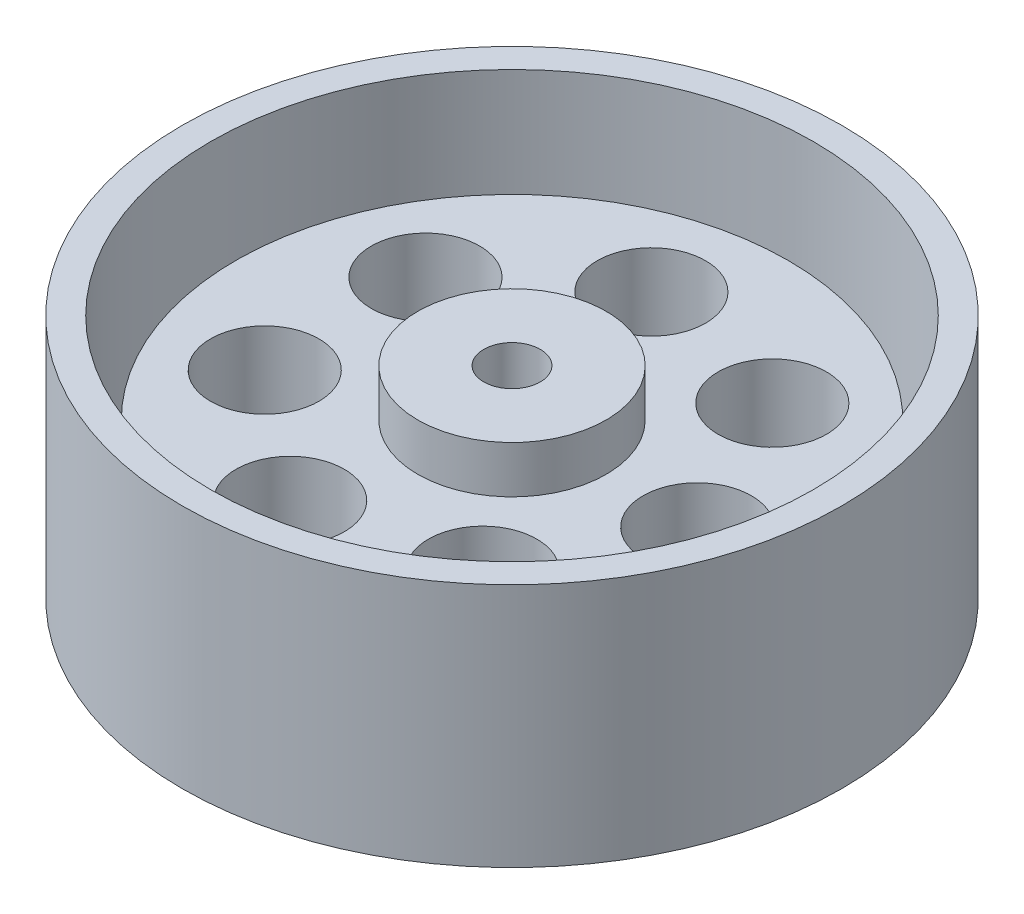
ISO-10303-21;
HEADER;
FILE_DESCRIPTION(('STEP AP214'),'2;1');
FILE_NAME('part.step','',(''),(''),'','','');
FILE_SCHEMA(('AUTOMOTIVE_DESIGN { 1 0 10303 214 1 1 1 1 }'));
ENDSEC;
DATA;
#1=APPLICATION_CONTEXT('core data for automotive mechanical design processes');
#2=APPLICATION_PROTOCOL_DEFINITION('international standard','automotive_design',2000,#1);
#3=PRODUCT_CONTEXT('',#1,'mechanical');
#4=PRODUCT('Part','Part','',(#3));
#5=PRODUCT_RELATED_PRODUCT_CATEGORY('part','',(#4));
#6=PRODUCT_DEFINITION_FORMATION('','',#4);
#7=PRODUCT_DEFINITION_CONTEXT('part definition',#1,'design');
#8=PRODUCT_DEFINITION('design','',#6,#7);
#9=PRODUCT_DEFINITION_SHAPE('','',#8);
#10=(LENGTH_UNIT() NAMED_UNIT(*) SI_UNIT(.MILLI.,.METRE.));
#11=(NAMED_UNIT(*) PLANE_ANGLE_UNIT() SI_UNIT($,.RADIAN.));
#12=(NAMED_UNIT(*) SI_UNIT($,.STERADIAN.) SOLID_ANGLE_UNIT());
#13=UNCERTAINTY_MEASURE_WITH_UNIT(LENGTH_MEASURE(1.E-05),#10,'distance_accuracy_value','');
#14=(GEOMETRIC_REPRESENTATION_CONTEXT(3) GLOBAL_UNCERTAINTY_ASSIGNED_CONTEXT((#13)) GLOBAL_UNIT_ASSIGNED_CONTEXT((#10,
#11,#12)) REPRESENTATION_CONTEXT('',''));
#15=CARTESIAN_POINT('',(0.,0.,0.));
#16=DIRECTION('',(0.,0.,1.));
#17=DIRECTION('',(1.,0.,0.));
#18=AXIS2_PLACEMENT_3D('',#15,#16,#17);
#19=CARTESIAN_POINT('',(0.,16.4,0.));
#20=DIRECTION('',(0.,1.,0.));
#21=DIRECTION('',(0.,0.,1.));
#22=AXIS2_PLACEMENT_3D('',#19,#20,#21);
#23=PLANE('',#22);
#24=CARTESIAN_POINT('',(12.260926953552,16.4,15.3747161027338));
#25=DIRECTION('',(0.,1.,0.));
#26=DIRECTION('',(0.,0.,1.));
#27=AXIS2_PLACEMENT_3D('',#24,#25,#26);
#28=CIRCLE('',#27,5.75);
#29=CARTESIAN_POINT('',(12.260926953552,16.4,21.1247161027338));
#30=VERTEX_POINT('',#29);
#31=EDGE_CURVE('E392',#30,#30,#28,.T.);
#32=ORIENTED_EDGE('',*,*,#31,.F.);
#33=EDGE_LOOP('',(#32));
#34=FACE_BOUND('',#33,.T.);
#35=CARTESIAN_POINT('',(-4.375874166251,16.4,19.1719573930555));
#36=DIRECTION('',(0.,1.,0.));
#37=DIRECTION('',(0.,0.,1.));
#38=AXIS2_PLACEMENT_3D('',#35,#36,#37);
#39=CIRCLE('',#38,5.75);
#40=CARTESIAN_POINT('',(-4.375874166251,16.4,24.9219573930555));
#41=VERTEX_POINT('',#40);
#42=EDGE_CURVE('E403',#41,#41,#39,.T.);
#43=ORIENTED_EDGE('',*,*,#42,.F.);
#44=EDGE_LOOP('',(#43));
#45=FACE_BOUND('',#44,.T.);
#46=CARTESIAN_POINT('',(-17.7175527873011,16.4,8.53232372974667));
#47=DIRECTION('',(0.,1.,0.));
#48=DIRECTION('',(0.,0.,1.));
#49=AXIS2_PLACEMENT_3D('',#46,#47,#48);
#50=CIRCLE('',#49,5.75);
#51=CARTESIAN_POINT('',(-17.7175527873011,16.4,14.2823237297467));
#52=VERTEX_POINT('',#51);
#53=EDGE_CURVE('E409',#52,#52,#50,.T.);
#54=ORIENTED_EDGE('',*,*,#53,.F.);
#55=EDGE_LOOP('',(#54));
#56=FACE_BOUND('',#55,.T.);
#57=CARTESIAN_POINT('',(-17.717552787301,16.4,-8.53232372974692));
#58=DIRECTION('',(0.,1.,0.));
#59=DIRECTION('',(0.,0.,1.));
#60=AXIS2_PLACEMENT_3D('',#57,#58,#59);
#61=CIRCLE('',#60,5.75);
#62=CARTESIAN_POINT('',(-17.717552787301,16.4,-2.78232372974691));
#63=VERTEX_POINT('',#62);
#64=EDGE_CURVE('E415',#63,#63,#61,.T.);
#65=ORIENTED_EDGE('',*,*,#64,.F.);
#66=EDGE_LOOP('',(#65));
#67=FACE_BOUND('',#66,.T.);
#68=CARTESIAN_POINT('',(-4.37587416625074,16.4,-19.1719573930556));
#69=DIRECTION('',(0.,1.,0.));
#70=DIRECTION('',(0.,0.,1.));
#71=AXIS2_PLACEMENT_3D('',#68,#69,#70);
#72=CIRCLE('',#71,5.75);
#73=CARTESIAN_POINT('',(-4.37587416625074,16.4,-13.4219573930556));
#74=VERTEX_POINT('',#73);
#75=EDGE_CURVE('E421',#74,#74,#72,.T.);
#76=ORIENTED_EDGE('',*,*,#75,.F.);
#77=EDGE_LOOP('',(#76));
#78=FACE_BOUND('',#77,.T.);
#79=CARTESIAN_POINT('',(12.2609269535522,16.4,-15.3747161027337));
#80=DIRECTION('',(0.,1.,0.));
#81=DIRECTION('',(0.,0.,1.));
#82=AXIS2_PLACEMENT_3D('',#79,#80,#81);
#83=CIRCLE('',#82,5.75);
#84=CARTESIAN_POINT('',(12.2609269535522,16.4,-9.62471610273365));
#85=VERTEX_POINT('',#84);
#86=EDGE_CURVE('E427',#85,#85,#83,.T.);
#87=ORIENTED_EDGE('',*,*,#86,.F.);
#88=EDGE_LOOP('',(#87));
#89=FACE_BOUND('',#88,.T.);
#90=CARTESIAN_POINT('',(19.665,16.4,0.));
#91=DIRECTION('',(0.,1.,0.));
#92=DIRECTION('',(0.,0.,1.));
#93=AXIS2_PLACEMENT_3D('',#90,#91,#92);
#94=CIRCLE('',#93,5.75);
#95=CARTESIAN_POINT('',(19.665,16.4,5.75));
#96=VERTEX_POINT('',#95);
#97=EDGE_CURVE('E391',#96,#96,#94,.T.);
#98=ORIENTED_EDGE('',*,*,#97,.F.);
#99=EDGE_LOOP('',(#98));
#100=FACE_BOUND('',#99,.T.);
#101=CARTESIAN_POINT('',(0.,16.4,0.));
#102=DIRECTION('',(0.,1.,0.));
#103=DIRECTION('',(0.,0.,1.));
#104=AXIS2_PLACEMENT_3D('',#101,#102,#103);
#105=CIRCLE('',#104,29.33);
#106=CARTESIAN_POINT('',(0.,16.4,-29.33));
#107=VERTEX_POINT('',#106);
#108=EDGE_CURVE('E99',#107,#107,#105,.T.);
#109=ORIENTED_EDGE('',*,*,#108,.T.);
#110=EDGE_LOOP('',(#109));
#111=FACE_BOUND('',#110,.T.);
#112=CARTESIAN_POINT('',(0.,16.4,0.));
#113=DIRECTION('',(0.,1.,0.));
#114=DIRECTION('',(0.,0.,1.));
#115=AXIS2_PLACEMENT_3D('',#112,#113,#114);
#116=CIRCLE('',#115,10.);
#117=CARTESIAN_POINT('',(0.,16.4,10.));
#118=VERTEX_POINT('',#117);
#119=EDGE_CURVE('E435',#118,#118,#116,.T.);
#120=ORIENTED_EDGE('',*,*,#119,.F.);
#121=EDGE_LOOP('',(#120));
#122=FACE_BOUND('',#121,.T.);
#123=ADVANCED_FACE('F56',(#34,#45,#56,#67,#78,#89,#100,#111,#122),#23,.T.);
#124=CARTESIAN_POINT('',(0.,3.5,0.));
#125=DIRECTION('',(0.,1.,0.));
#126=DIRECTION('',(0.,0.,1.));
#127=AXIS2_PLACEMENT_3D('',#124,#125,#126);
#128=PLANE('',#127);
#129=CARTESIAN_POINT('',(0.,3.5,0.));
#130=DIRECTION('',(0.,1.,0.));
#131=DIRECTION('',(0.,0.,1.));
#132=AXIS2_PLACEMENT_3D('',#129,#130,#131);
#133=CIRCLE('',#132,29.33);
#134=CARTESIAN_POINT('',(0.,3.5,-29.33));
#135=VERTEX_POINT('',#134);
#136=EDGE_CURVE('E95',#135,#135,#133,.T.);
#137=ORIENTED_EDGE('',*,*,#136,.F.);
#138=EDGE_LOOP('',(#137));
#139=FACE_BOUND('',#138,.T.);
#140=CARTESIAN_POINT('',(0.,3.5,0.));
#141=DIRECTION('',(0.,1.,0.));
#142=DIRECTION('',(0.,0.,1.));
#143=AXIS2_PLACEMENT_3D('',#140,#141,#142);
#144=CIRCLE('',#143,32.);
#145=CARTESIAN_POINT('',(0.,3.5,-32.));
#146=VERTEX_POINT('',#145);
#147=EDGE_CURVE('E12',#146,#146,#144,.F.);
#148=ORIENTED_EDGE('',*,*,#147,.F.);
#149=EDGE_LOOP('',(#148));
#150=FACE_BOUND('',#149,.T.);
#151=ADVANCED_FACE('F128',(#139,#150),#128,.T.);
#152=CARTESIAN_POINT('',(0.,3.5,0.));
#153=DIRECTION('',(0.,-1.,0.));
#154=DIRECTION('',(0.,0.,-1.));
#155=AXIS2_PLACEMENT_3D('',#152,#153,#154);
#156=CYLINDRICAL_SURFACE('',#155,35.);
#157=CARTESIAN_POINT('',(0.,0.,0.));
#158=DIRECTION('',(0.,1.,0.));
#159=DIRECTION('',(0.,0.,1.));
#160=AXIS2_PLACEMENT_3D('',#157,#158,#159);
#161=CIRCLE('',#160,35.);
#162=CARTESIAN_POINT('',(0.,0.,35.));
#163=VERTEX_POINT('',#162);
#164=EDGE_CURVE('E60',#163,#163,#161,.T.);
#165=ORIENTED_EDGE('',*,*,#164,.T.);
#166=EDGE_LOOP('',(#165));
#167=FACE_BOUND('',#166,.T.);
#168=CARTESIAN_POINT('',(0.,26.,0.));
#169=DIRECTION('',(0.,1.,0.));
#170=DIRECTION('',(0.,0.,1.));
#171=AXIS2_PLACEMENT_3D('',#168,#169,#170);
#172=CIRCLE('',#171,35.);
#173=CARTESIAN_POINT('',(0.,26.,35.));
#174=VERTEX_POINT('',#173);
#175=EDGE_CURVE('E110',#174,#174,#172,.T.);
#176=ORIENTED_EDGE('',*,*,#175,.F.);
#177=EDGE_LOOP('',(#176));
#178=FACE_BOUND('',#177,.T.);
#179=ADVANCED_FACE('F58',(#167,#178),#156,.T.);
#180=CARTESIAN_POINT('',(0.,0.,0.));
#181=DIRECTION('',(0.,1.,0.));
#182=DIRECTION('',(0.,0.,1.));
#183=AXIS2_PLACEMENT_3D('',#180,#181,#182);
#184=PLANE('',#183);
#185=ORIENTED_EDGE('',*,*,#164,.F.);
#186=EDGE_LOOP('',(#185));
#187=FACE_BOUND('',#186,.T.);
#188=ADVANCED_FACE('F119',(#187),#184,.F.);
#189=CARTESIAN_POINT('',(0.,26.,0.));
#190=DIRECTION('',(0.,1.,0.));
#191=DIRECTION('',(0.,0.,1.));
#192=AXIS2_PLACEMENT_3D('',#189,#190,#191);
#193=PLANE('',#192);
#194=ORIENTED_EDGE('',*,*,#175,.T.);
#195=EDGE_LOOP('',(#194));
#196=FACE_BOUND('',#195,.T.);
#197=CARTESIAN_POINT('',(0.,26.,0.));
#198=DIRECTION('',(0.,1.,0.));
#199=DIRECTION('',(0.,0.,1.));
#200=AXIS2_PLACEMENT_3D('',#197,#198,#199);
#201=CIRCLE('',#200,32.);
#202=CARTESIAN_POINT('',(0.,26.,-32.));
#203=VERTEX_POINT('',#202);
#204=EDGE_CURVE('E107',#203,#203,#201,.T.);
#205=ORIENTED_EDGE('',*,*,#204,.F.);
#206=EDGE_LOOP('',(#205));
#207=FACE_BOUND('',#206,.T.);
#208=ADVANCED_FACE('F121',(#196,#207),#193,.T.);
#209=CARTESIAN_POINT('',(0.,26.,0.));
#210=DIRECTION('',(0.,-1.,0.));
#211=DIRECTION('',(0.,0.,-1.));
#212=AXIS2_PLACEMENT_3D('',#209,#210,#211);
#213=CYLINDRICAL_SURFACE('',#212,32.);
#214=CARTESIAN_POINT('',(0.,3.5,-32.));
#215=CARTESIAN_POINT('',(0.,3.734375,-32.));
#216=CARTESIAN_POINT('',(0.,3.96875,-32.));
#217=CARTESIAN_POINT('',(0.,4.4375,-32.));
#218=CARTESIAN_POINT('',(0.,4.671875,-32.));
#219=CARTESIAN_POINT('',(0.,5.140625,-32.));
#220=CARTESIAN_POINT('',(0.,5.375,-32.));
#221=CARTESIAN_POINT('',(0.,5.84375,-32.));
#222=CARTESIAN_POINT('',(0.,6.078125,-32.));
#223=CARTESIAN_POINT('',(0.,6.546875,-32.));
#224=CARTESIAN_POINT('',(0.,6.78125,-32.));
#225=CARTESIAN_POINT('',(0.,7.25,-32.));
#226=CARTESIAN_POINT('',(0.,7.484375,-32.));
#227=CARTESIAN_POINT('',(0.,7.953125,-32.));
#228=CARTESIAN_POINT('',(0.,8.18749999999999,-32.));
#229=CARTESIAN_POINT('',(0.,8.65624999999999,-32.));
#230=CARTESIAN_POINT('',(0.,8.890625,-32.));
#231=CARTESIAN_POINT('',(0.,9.359375,-32.));
#232=CARTESIAN_POINT('',(0.,9.59375,-32.));
#233=CARTESIAN_POINT('',(0.,10.0625,-32.));
#234=CARTESIAN_POINT('',(0.,10.296875,-32.));
#235=CARTESIAN_POINT('',(0.,10.765625,-32.));
#236=CARTESIAN_POINT('',(0.,11.,-32.));
#237=CARTESIAN_POINT('',(0.,11.46875,-32.));
#238=CARTESIAN_POINT('',(0.,11.703125,-32.));
#239=CARTESIAN_POINT('',(0.,12.171875,-32.));
#240=CARTESIAN_POINT('',(0.,12.40625,-32.));
#241=CARTESIAN_POINT('',(0.,12.875,-32.));
#242=CARTESIAN_POINT('',(0.,13.109375,-32.));
#243=CARTESIAN_POINT('',(0.,13.578125,-32.));
#244=CARTESIAN_POINT('',(0.,13.8125,-32.));
#245=CARTESIAN_POINT('',(0.,14.28125,-32.));
#246=CARTESIAN_POINT('',(0.,14.515625,-32.));
#247=CARTESIAN_POINT('',(0.,14.984375,-32.));
#248=CARTESIAN_POINT('',(0.,15.21875,-32.));
#249=CARTESIAN_POINT('',(0.,15.6875,-32.));
#250=CARTESIAN_POINT('',(0.,15.921875,-32.));
#251=CARTESIAN_POINT('',(0.,16.390625,-32.));
#252=CARTESIAN_POINT('',(0.,16.625,-32.));
#253=CARTESIAN_POINT('',(0.,17.09375,-32.));
#254=CARTESIAN_POINT('',(0.,17.328125,-32.));
#255=CARTESIAN_POINT('',(0.,17.796875,-32.));
#256=CARTESIAN_POINT('',(0.,18.03125,-32.));
#257=CARTESIAN_POINT('',(0.,18.5,-32.));
#258=CARTESIAN_POINT('',(0.,18.734375,-32.));
#259=CARTESIAN_POINT('',(0.,19.203125,-32.));
#260=CARTESIAN_POINT('',(0.,19.4375,-32.));
#261=CARTESIAN_POINT('',(0.,19.90625,-32.));
#262=CARTESIAN_POINT('',(0.,20.140625,-32.));
#263=CARTESIAN_POINT('',(0.,20.609375,-32.));
#264=CARTESIAN_POINT('',(0.,20.84375,-32.));
#265=CARTESIAN_POINT('',(0.,21.3125,-32.));
#266=CARTESIAN_POINT('',(0.,21.546875,-32.));
#267=CARTESIAN_POINT('',(0.,22.015625,-32.));
#268=CARTESIAN_POINT('',(0.,22.25,-32.));
#269=CARTESIAN_POINT('',(0.,22.71875,-32.));
#270=CARTESIAN_POINT('',(0.,22.953125,-32.));
#271=CARTESIAN_POINT('',(0.,23.421875,-32.));
#272=CARTESIAN_POINT('',(0.,23.65625,-32.));
#273=CARTESIAN_POINT('',(0.,24.125,-32.));
#274=CARTESIAN_POINT('',(0.,24.359375,-32.));
#275=CARTESIAN_POINT('',(0.,24.828125,-32.));
#276=CARTESIAN_POINT('',(0.,25.0625,-32.));
#277=CARTESIAN_POINT('',(0.,25.53125,-32.));
#278=CARTESIAN_POINT('',(0.,25.765625,-32.));
#279=CARTESIAN_POINT('',(0.,26.,-32.));
#280=B_SPLINE_CURVE_WITH_KNOTS('',3,(#214,#215,#216,#217,#218,#219,#220,#221,#222,#223,#224,
#225,#226,#227,#228,#229,#230,#231,#232,#233,#234,#235,#236,#237,#238,#239,#240,#241,#242,#243,
#244,#245,#246,#247,#248,#249,#250,#251,#252,#253,#254,#255,#256,#257,#258,#259,#260,#261,#262,
#263,#264,#265,#266,#267,#268,#269,#270,#271,#272,#273,#274,#275,#276,#277,#278,#279),
.UNSPECIFIED.,.F.,.F.,(4,2,2,2,2,2,2,2,2,2,2,2,2,2,2,2,2,2,2,2,2,2,2,2,2,2,2,2,2,2,2,2,4),(0.,
0.703124999999999,1.40625,2.109375,2.8125,3.515625,4.21875,4.921875,5.625,6.328125,7.03125,
7.734375,8.4375,9.140625,9.84375,10.546875,11.25,11.953125,12.65625,13.359375,14.0625,14.765625,
15.46875,16.171875,16.875,17.578125,18.28125,18.984375,19.6875,20.390625,21.09375,21.796875,
22.5),.UNSPECIFIED.);
#281=EDGE_CURVE('BSEAM126',#146,#203,#280,.T.);
#282=ORIENTED_EDGE('',*,*,#147,.T.);
#283=ORIENTED_EDGE('',*,*,#204,.T.);
#284=ORIENTED_EDGE('',*,*,#281,.T.);
#285=ORIENTED_EDGE('',*,*,#281,.F.);
#286=EDGE_LOOP('',(#282,#284,#283,#285));
#287=FACE_BOUND('',#286,.T.);
#288=ADVANCED_FACE('F126',(#287),#213,.F.);
#289=CARTESIAN_POINT('',(0.,16.4,0.));
#290=DIRECTION('',(0.,-1.,0.));
#291=DIRECTION('',(0.,0.,-1.));
#292=AXIS2_PLACEMENT_3D('',#289,#290,#291);
#293=CYLINDRICAL_SURFACE('',#292,29.33);
#294=CARTESIAN_POINT('',(0.,16.4,-29.33));
#295=CARTESIAN_POINT('',(0.,16.265625,-29.33));
#296=CARTESIAN_POINT('',(0.,16.13125,-29.33));
#297=CARTESIAN_POINT('',(0.,15.8625,-29.33));
#298=CARTESIAN_POINT('',(0.,15.728125,-29.33));
#299=CARTESIAN_POINT('',(0.,15.459375,-29.33));
#300=CARTESIAN_POINT('',(0.,15.325,-29.33));
#301=CARTESIAN_POINT('',(0.,15.05625,-29.33));
#302=CARTESIAN_POINT('',(0.,14.921875,-29.33));
#303=CARTESIAN_POINT('',(0.,14.653125,-29.33));
#304=CARTESIAN_POINT('',(0.,14.51875,-29.33));
#305=CARTESIAN_POINT('',(0.,14.25,-29.33));
#306=CARTESIAN_POINT('',(0.,14.115625,-29.33));
#307=CARTESIAN_POINT('',(0.,13.846875,-29.33));
#308=CARTESIAN_POINT('',(0.,13.7125,-29.33));
#309=CARTESIAN_POINT('',(0.,13.44375,-29.33));
#310=CARTESIAN_POINT('',(0.,13.309375,-29.33));
#311=CARTESIAN_POINT('',(0.,13.040625,-29.33));
#312=CARTESIAN_POINT('',(0.,12.90625,-29.33));
#313=CARTESIAN_POINT('',(0.,12.6375,-29.33));
#314=CARTESIAN_POINT('',(0.,12.503125,-29.33));
#315=CARTESIAN_POINT('',(0.,12.234375,-29.33));
#316=CARTESIAN_POINT('',(0.,12.1,-29.33));
#317=CARTESIAN_POINT('',(0.,11.83125,-29.33));
#318=CARTESIAN_POINT('',(0.,11.696875,-29.33));
#319=CARTESIAN_POINT('',(0.,11.428125,-29.33));
#320=CARTESIAN_POINT('',(0.,11.29375,-29.33));
#321=CARTESIAN_POINT('',(0.,11.025,-29.33));
#322=CARTESIAN_POINT('',(0.,10.890625,-29.33));
#323=CARTESIAN_POINT('',(0.,10.621875,-29.33));
#324=CARTESIAN_POINT('',(0.,10.4875,-29.33));
#325=CARTESIAN_POINT('',(0.,10.21875,-29.33));
#326=CARTESIAN_POINT('',(0.,10.084375,-29.33));
#327=CARTESIAN_POINT('',(0.,9.815625,-29.33));
#328=CARTESIAN_POINT('',(0.,9.68125,-29.33));
#329=CARTESIAN_POINT('',(0.,9.4125,-29.33));
#330=CARTESIAN_POINT('',(0.,9.278125,-29.33));
#331=CARTESIAN_POINT('',(0.,9.009375,-29.33));
#332=CARTESIAN_POINT('',(0.,8.875,-29.33));
#333=CARTESIAN_POINT('',(0.,8.60625,-29.33));
#334=CARTESIAN_POINT('',(0.,8.471875,-29.33));
#335=CARTESIAN_POINT('',(0.,8.203125,-29.33));
#336=CARTESIAN_POINT('',(0.,8.06875,-29.33));
#337=CARTESIAN_POINT('',(0.,7.8,-29.33));
#338=CARTESIAN_POINT('',(0.,7.665625,-29.33));
#339=CARTESIAN_POINT('',(0.,7.396875,-29.33));
#340=CARTESIAN_POINT('',(0.,7.2625,-29.33));
#341=CARTESIAN_POINT('',(0.,6.99375,-29.33));
#342=CARTESIAN_POINT('',(0.,6.859375,-29.33));
#343=CARTESIAN_POINT('',(0.,6.590625,-29.33));
#344=CARTESIAN_POINT('',(0.,6.45625,-29.33));
#345=CARTESIAN_POINT('',(0.,6.1875,-29.33));
#346=CARTESIAN_POINT('',(0.,6.053125,-29.33));
#347=CARTESIAN_POINT('',(0.,5.784375,-29.33));
#348=CARTESIAN_POINT('',(0.,5.65,-29.33));
#349=CARTESIAN_POINT('',(0.,5.38125,-29.33));
#350=CARTESIAN_POINT('',(0.,5.246875,-29.33));
#351=CARTESIAN_POINT('',(0.,4.978125,-29.33));
#352=CARTESIAN_POINT('',(0.,4.84375,-29.33));
#353=CARTESIAN_POINT('',(0.,4.575,-29.33));
#354=CARTESIAN_POINT('',(0.,4.440625,-29.33));
#355=CARTESIAN_POINT('',(0.,4.171875,-29.33));
#356=CARTESIAN_POINT('',(0.,4.0375,-29.33));
#357=CARTESIAN_POINT('',(0.,3.76875,-29.33));
#358=CARTESIAN_POINT('',(0.,3.634375,-29.33));
#359=CARTESIAN_POINT('',(0.,3.5,-29.33));
#360=B_SPLINE_CURVE_WITH_KNOTS('',3,(#294,#295,#296,#297,#298,#299,#300,#301,#302,#303,#304,
#305,#306,#307,#308,#309,#310,#311,#312,#313,#314,#315,#316,#317,#318,#319,#320,#321,#322,#323,
#324,#325,#326,#327,#328,#329,#330,#331,#332,#333,#334,#335,#336,#337,#338,#339,#340,#341,#342,
#343,#344,#345,#346,#347,#348,#349,#350,#351,#352,#353,#354,#355,#356,#357,#358,#359),
.UNSPECIFIED.,.F.,.F.,(4,2,2,2,2,2,2,2,2,2,2,2,2,2,2,2,2,2,2,2,2,2,2,2,2,2,2,2,2,2,2,2,4),(0.,
0.403125000000001,0.806250000000001,1.209375,1.6125,2.015625,2.41875,2.821875,3.225,3.628125,
4.03125,4.434375,4.8375,5.240625,5.64375,6.046875,6.45,6.853125,7.25625,7.659375,8.0625,
8.465625,8.86875,9.271875,9.675,10.078125,10.48125,10.884375,11.2875,11.690625,12.09375,
12.496875,12.9),.UNSPECIFIED.);
#361=EDGE_CURVE('BSEAM144',#107,#135,#360,.T.);
#362=ORIENTED_EDGE('',*,*,#108,.F.);
#363=ORIENTED_EDGE('',*,*,#136,.T.);
#364=ORIENTED_EDGE('',*,*,#361,.T.);
#365=ORIENTED_EDGE('',*,*,#361,.F.);
#366=EDGE_LOOP('',(#362,#364,#363,#365));
#367=FACE_BOUND('',#366,.T.);
#368=ADVANCED_FACE('F144',(#367),#293,.T.);
#369=CARTESIAN_POINT('',(0.,21.4,0.));
#370=DIRECTION('',(0.,1.,0.));
#371=DIRECTION('',(0.,0.,1.));
#372=AXIS2_PLACEMENT_3D('',#369,#370,#371);
#373=PLANE('',#372);
#374=CARTESIAN_POINT('',(0.,21.4,0.));
#375=DIRECTION('',(0.,1.,0.));
#376=DIRECTION('',(0.,0.,1.));
#377=AXIS2_PLACEMENT_3D('',#374,#375,#376);
#378=CIRCLE('',#377,10.);
#379=CARTESIAN_POINT('',(0.,21.4,10.));
#380=VERTEX_POINT('',#379);
#381=EDGE_CURVE('E96',#380,#380,#378,.T.);
#382=ORIENTED_EDGE('',*,*,#381,.T.);
#383=EDGE_LOOP('',(#382));
#384=FACE_BOUND('',#383,.T.);
#385=CARTESIAN_POINT('',(0.,21.4,0.));
#386=DIRECTION('',(0.,1.,0.));
#387=DIRECTION('',(0.,0.,1.));
#388=AXIS2_PLACEMENT_3D('',#385,#386,#387);
#389=CIRCLE('',#388,3.);
#390=CARTESIAN_POINT('',(0.,21.4,3.));
#391=VERTEX_POINT('',#390);
#392=EDGE_CURVE('E431',#391,#391,#389,.T.);
#393=ORIENTED_EDGE('',*,*,#392,.F.);
#394=EDGE_LOOP('',(#393));
#395=FACE_BOUND('',#394,.T.);
#396=ADVANCED_FACE('F147',(#384,#395),#373,.T.);
#397=CARTESIAN_POINT('',(0.,21.4,0.));
#398=DIRECTION('',(0.,-1.,0.));
#399=DIRECTION('',(0.,0.,-1.));
#400=AXIS2_PLACEMENT_3D('',#397,#398,#399);
#401=CYLINDRICAL_SURFACE('',#400,10.);
#402=ORIENTED_EDGE('',*,*,#381,.F.);
#403=EDGE_LOOP('',(#402));
#404=FACE_BOUND('',#403,.T.);
#405=ORIENTED_EDGE('',*,*,#119,.T.);
#406=EDGE_LOOP('',(#405));
#407=FACE_BOUND('',#406,.T.);
#408=ADVANCED_FACE('F152',(#404,#407),#401,.T.);
#409=CARTESIAN_POINT('',(0.,13.5,0.));
#410=DIRECTION('',(0.,1.,0.));
#411=DIRECTION('',(0.,0.,1.));
#412=AXIS2_PLACEMENT_3D('',#409,#410,#411);
#413=PLANE('',#412);
#414=CARTESIAN_POINT('',(0.,13.5,0.));
#415=DIRECTION('',(0.,1.,0.));
#416=DIRECTION('',(0.,0.,1.));
#417=AXIS2_PLACEMENT_3D('',#414,#415,#416);
#418=CIRCLE('',#417,3.);
#419=CARTESIAN_POINT('',(2.59807621135332,13.5,-1.5));
#420=VERTEX_POINT('',#419);
#421=CARTESIAN_POINT('',(-2.59807621135332,13.5,-1.5));
#422=VERTEX_POINT('',#421);
#423=EDGE_CURVE('E76',#420,#422,#418,.T.);
#424=ORIENTED_EDGE('',*,*,#423,.T.);
#425=DIRECTION('',(1.,0.,0.));
#426=VECTOR('',#425,1.);
#427=CARTESIAN_POINT('',(0.,13.5,-1.5));
#428=LINE('',#427,#426);
#429=EDGE_CURVE('E89',#422,#420,#428,.T.);
#430=ORIENTED_EDGE('',*,*,#429,.T.);
#431=EDGE_LOOP('',(#424,#430));
#432=FACE_BOUND('',#431,.T.);
#433=ADVANCED_FACE('F149',(#432),#413,.T.);
#434=CARTESIAN_POINT('',(0.,3.5,0.));
#435=DIRECTION('',(0.,1.,0.));
#436=DIRECTION('',(0.,0.,1.));
#437=AXIS2_PLACEMENT_3D('',#434,#435,#436);
#438=CIRCLE('',#437,3.);
#439=CARTESIAN_POINT('',(-2.59807621135332,3.5,-1.5));
#440=VERTEX_POINT('',#439);
#441=CARTESIAN_POINT('',(2.59807621135332,3.5,-1.5));
#442=VERTEX_POINT('',#441);
#443=EDGE_CURVE('E86',#440,#442,#438,.T.);
#444=ORIENTED_EDGE('',*,*,#443,.T.);
#445=DIRECTION('',(1.,0.,0.));
#446=VECTOR('',#445,1.);
#447=CARTESIAN_POINT('',(0.,3.5,-1.5));
#448=LINE('',#447,#446);
#449=EDGE_CURVE('E94',#440,#442,#448,.T.);
#450=ORIENTED_EDGE('',*,*,#449,.F.);
#451=EDGE_LOOP('',(#444,#450));
#452=FACE_BOUND('',#451,.T.);
#453=ADVANCED_FACE('F93',(#452),#128,.T.);
#454=CARTESIAN_POINT('',(0.,13.5,-1.5));
#455=DIRECTION('',(0.,0.,-1.));
#456=DIRECTION('',(-1.,0.,0.));
#457=AXIS2_PLACEMENT_3D('',#454,#455,#456);
#458=PLANE('',#457);
#459=ORIENTED_EDGE('',*,*,#449,.T.);
#460=DIRECTION('',(0.,-1.,0.));
#461=VECTOR('',#460,1.);
#462=CARTESIAN_POINT('',(2.59807621135332,13.5,-1.5));
#463=LINE('',#462,#461);
#464=EDGE_CURVE('E82',#420,#442,#463,.T.);
#465=ORIENTED_EDGE('',*,*,#464,.F.);
#466=ORIENTED_EDGE('',*,*,#429,.F.);
#467=DIRECTION('',(0.,-1.,0.));
#468=VECTOR('',#467,1.);
#469=CARTESIAN_POINT('',(-2.59807621135332,13.5,-1.5));
#470=LINE('',#469,#468);
#471=EDGE_CURVE('E71',#422,#440,#470,.T.);
#472=ORIENTED_EDGE('',*,*,#471,.T.);
#473=EDGE_LOOP('',(#459,#465,#466,#472));
#474=FACE_BOUND('',#473,.T.);
#475=ADVANCED_FACE('F98',(#474),#458,.F.);
#476=CARTESIAN_POINT('',(0.,16.4,0.));
#477=DIRECTION('',(0.,-1.,0.));
#478=DIRECTION('',(0.,0.,-1.));
#479=AXIS2_PLACEMENT_3D('',#476,#477,#478);
#480=CYLINDRICAL_SURFACE('',#479,3.);
#481=ORIENTED_EDGE('',*,*,#464,.T.);
#482=ORIENTED_EDGE('',*,*,#443,.F.);
#483=ORIENTED_EDGE('',*,*,#471,.F.);
#484=ORIENTED_EDGE('',*,*,#423,.F.);
#485=EDGE_LOOP('',(#481,#482,#483,#484));
#486=FACE_BOUND('',#485,.T.);
#487=ORIENTED_EDGE('',*,*,#392,.T.);
#488=EDGE_LOOP('',(#487));
#489=FACE_BOUND('',#488,.T.);
#490=ADVANCED_FACE('F84',(#486,#489),#480,.F.);
#491=CARTESIAN_POINT('',(19.665,3.7,0.));
#492=DIRECTION('',(0.,1.,0.));
#493=DIRECTION('',(0.,0.,1.));
#494=AXIS2_PLACEMENT_3D('',#491,#492,#493);
#495=CYLINDRICAL_SURFACE('',#494,5.75);
#496=CARTESIAN_POINT('',(19.665,3.7,0.));
#497=DIRECTION('',(0.,1.,0.));
#498=DIRECTION('',(0.,0.,1.));
#499=AXIS2_PLACEMENT_3D('',#496,#497,#498);
#500=CIRCLE('',#499,5.75);
#501=CARTESIAN_POINT('',(19.665,3.7,5.75));
#502=VERTEX_POINT('',#501);
#503=EDGE_CURVE('E395',#502,#502,#500,.T.);
#504=ORIENTED_EDGE('',*,*,#503,.F.);
#505=EDGE_LOOP('',(#504));
#506=FACE_BOUND('',#505,.T.);
#507=ORIENTED_EDGE('',*,*,#97,.T.);
#508=EDGE_LOOP('',(#507));
#509=FACE_BOUND('',#508,.T.);
#510=ADVANCED_FACE('F203',(#506,#509),#495,.F.);
#511=CARTESIAN_POINT('',(19.665,3.7,0.));
#512=DIRECTION('',(0.,1.,0.));
#513=DIRECTION('',(0.,0.,1.));
#514=AXIS2_PLACEMENT_3D('',#511,#512,#513);
#515=PLANE('',#514);
#516=ORIENTED_EDGE('',*,*,#503,.T.);
#517=EDGE_LOOP('',(#516));
#518=FACE_BOUND('',#517,.T.);
#519=ADVANCED_FACE('F208',(#518),#515,.T.);
#520=CARTESIAN_POINT('',(12.2609269535522,3.7,-15.3747161027337));
#521=DIRECTION('',(0.,1.,0.));
#522=DIRECTION('',(0.,0.,1.));
#523=AXIS2_PLACEMENT_3D('',#520,#521,#522);
#524=CYLINDRICAL_SURFACE('',#523,5.75);
#525=CARTESIAN_POINT('',(12.2609269535522,3.7,-15.3747161027337));
#526=DIRECTION('',(0.,1.,0.));
#527=DIRECTION('',(0.,0.,1.));
#528=AXIS2_PLACEMENT_3D('',#525,#526,#527);
#529=CIRCLE('',#528,5.75);
#530=CARTESIAN_POINT('',(12.2609269535522,3.7,-9.62471610273365));
#531=VERTEX_POINT('',#530);
#532=EDGE_CURVE('E424',#531,#531,#529,.T.);
#533=ORIENTED_EDGE('',*,*,#532,.F.);
#534=EDGE_LOOP('',(#533));
#535=FACE_BOUND('',#534,.T.);
#536=ORIENTED_EDGE('',*,*,#86,.T.);
#537=EDGE_LOOP('',(#536));
#538=FACE_BOUND('',#537,.T.);
#539=ADVANCED_FACE('F216',(#535,#538),#524,.F.);
#540=CARTESIAN_POINT('',(12.2609269535522,3.7,-15.3747161027337));
#541=DIRECTION('',(0.,1.,0.));
#542=DIRECTION('',(0.,0.,1.));
#543=AXIS2_PLACEMENT_3D('',#540,#541,#542);
#544=PLANE('',#543);
#545=ORIENTED_EDGE('',*,*,#532,.T.);
#546=EDGE_LOOP('',(#545));
#547=FACE_BOUND('',#546,.T.);
#548=ADVANCED_FACE('F224',(#547),#544,.T.);
#549=CARTESIAN_POINT('',(-4.37587416625074,3.7,-19.1719573930556));
#550=DIRECTION('',(0.,1.,0.));
#551=DIRECTION('',(0.,0.,1.));
#552=AXIS2_PLACEMENT_3D('',#549,#550,#551);
#553=CYLINDRICAL_SURFACE('',#552,5.75);
#554=CARTESIAN_POINT('',(-4.37587416625074,3.7,-19.1719573930556));
#555=DIRECTION('',(0.,1.,0.));
#556=DIRECTION('',(0.,0.,1.));
#557=AXIS2_PLACEMENT_3D('',#554,#555,#556);
#558=CIRCLE('',#557,5.75);
#559=CARTESIAN_POINT('',(-4.37587416625074,3.7,-13.4219573930556));
#560=VERTEX_POINT('',#559);
#561=EDGE_CURVE('E418',#560,#560,#558,.T.);
#562=ORIENTED_EDGE('',*,*,#561,.F.);
#563=EDGE_LOOP('',(#562));
#564=FACE_BOUND('',#563,.T.);
#565=ORIENTED_EDGE('',*,*,#75,.T.);
#566=EDGE_LOOP('',(#565));
#567=FACE_BOUND('',#566,.T.);
#568=ADVANCED_FACE('F232',(#564,#567),#553,.F.);
#569=CARTESIAN_POINT('',(-4.37587416625074,3.7,-19.1719573930556));
#570=DIRECTION('',(0.,1.,0.));
#571=DIRECTION('',(0.,0.,1.));
#572=AXIS2_PLACEMENT_3D('',#569,#570,#571);
#573=PLANE('',#572);
#574=ORIENTED_EDGE('',*,*,#561,.T.);
#575=EDGE_LOOP('',(#574));
#576=FACE_BOUND('',#575,.T.);
#577=ADVANCED_FACE('F240',(#576),#573,.T.);
#578=CARTESIAN_POINT('',(-17.717552787301,3.7,-8.53232372974692));
#579=DIRECTION('',(0.,1.,0.));
#580=DIRECTION('',(0.,0.,1.));
#581=AXIS2_PLACEMENT_3D('',#578,#579,#580);
#582=CYLINDRICAL_SURFACE('',#581,5.75);
#583=CARTESIAN_POINT('',(-17.717552787301,3.7,-8.53232372974692));
#584=DIRECTION('',(0.,1.,0.));
#585=DIRECTION('',(0.,0.,1.));
#586=AXIS2_PLACEMENT_3D('',#583,#584,#585);
#587=CIRCLE('',#586,5.75);
#588=CARTESIAN_POINT('',(-17.717552787301,3.7,-2.78232372974691));
#589=VERTEX_POINT('',#588);
#590=EDGE_CURVE('E412',#589,#589,#587,.T.);
#591=ORIENTED_EDGE('',*,*,#590,.F.);
#592=EDGE_LOOP('',(#591));
#593=FACE_BOUND('',#592,.T.);
#594=ORIENTED_EDGE('',*,*,#64,.T.);
#595=EDGE_LOOP('',(#594));
#596=FACE_BOUND('',#595,.T.);
#597=ADVANCED_FACE('F248',(#593,#596),#582,.F.);
#598=CARTESIAN_POINT('',(-17.717552787301,3.7,-8.53232372974692));
#599=DIRECTION('',(0.,1.,0.));
#600=DIRECTION('',(0.,0.,1.));
#601=AXIS2_PLACEMENT_3D('',#598,#599,#600);
#602=PLANE('',#601);
#603=ORIENTED_EDGE('',*,*,#590,.T.);
#604=EDGE_LOOP('',(#603));
#605=FACE_BOUND('',#604,.T.);
#606=ADVANCED_FACE('F256',(#605),#602,.T.);
#607=CARTESIAN_POINT('',(-17.7175527873011,3.7,8.53232372974667));
#608=DIRECTION('',(0.,1.,0.));
#609=DIRECTION('',(0.,0.,1.));
#610=AXIS2_PLACEMENT_3D('',#607,#608,#609);
#611=CYLINDRICAL_SURFACE('',#610,5.75);
#612=CARTESIAN_POINT('',(-17.7175527873011,3.7,8.53232372974667));
#613=DIRECTION('',(0.,1.,0.));
#614=DIRECTION('',(0.,0.,1.));
#615=AXIS2_PLACEMENT_3D('',#612,#613,#614);
#616=CIRCLE('',#615,5.75);
#617=CARTESIAN_POINT('',(-17.7175527873011,3.7,14.2823237297467));
#618=VERTEX_POINT('',#617);
#619=EDGE_CURVE('E406',#618,#618,#616,.T.);
#620=ORIENTED_EDGE('',*,*,#619,.F.);
#621=EDGE_LOOP('',(#620));
#622=FACE_BOUND('',#621,.T.);
#623=ORIENTED_EDGE('',*,*,#53,.T.);
#624=EDGE_LOOP('',(#623));
#625=FACE_BOUND('',#624,.T.);
#626=ADVANCED_FACE('F264',(#622,#625),#611,.F.);
#627=CARTESIAN_POINT('',(-17.7175527873011,3.7,8.53232372974667));
#628=DIRECTION('',(0.,1.,0.));
#629=DIRECTION('',(0.,0.,1.));
#630=AXIS2_PLACEMENT_3D('',#627,#628,#629);
#631=PLANE('',#630);
#632=ORIENTED_EDGE('',*,*,#619,.T.);
#633=EDGE_LOOP('',(#632));
#634=FACE_BOUND('',#633,.T.);
#635=ADVANCED_FACE('F272',(#634),#631,.T.);
#636=CARTESIAN_POINT('',(-4.375874166251,3.7,19.1719573930555));
#637=DIRECTION('',(0.,1.,0.));
#638=DIRECTION('',(0.,0.,1.));
#639=AXIS2_PLACEMENT_3D('',#636,#637,#638);
#640=CYLINDRICAL_SURFACE('',#639,5.75);
#641=CARTESIAN_POINT('',(-4.375874166251,3.7,19.1719573930555));
#642=DIRECTION('',(0.,1.,0.));
#643=DIRECTION('',(0.,0.,1.));
#644=AXIS2_PLACEMENT_3D('',#641,#642,#643);
#645=CIRCLE('',#644,5.75);
#646=CARTESIAN_POINT('',(-4.375874166251,3.7,24.9219573930555));
#647=VERTEX_POINT('',#646);
#648=EDGE_CURVE('E398',#647,#647,#645,.T.);
#649=ORIENTED_EDGE('',*,*,#648,.F.);
#650=EDGE_LOOP('',(#649));
#651=FACE_BOUND('',#650,.T.);
#652=ORIENTED_EDGE('',*,*,#42,.T.);
#653=EDGE_LOOP('',(#652));
#654=FACE_BOUND('',#653,.T.);
#655=ADVANCED_FACE('F280',(#651,#654),#640,.F.);
#656=CARTESIAN_POINT('',(-4.375874166251,3.7,19.1719573930555));
#657=DIRECTION('',(0.,1.,0.));
#658=DIRECTION('',(0.,0.,1.));
#659=AXIS2_PLACEMENT_3D('',#656,#657,#658);
#660=PLANE('',#659);
#661=ORIENTED_EDGE('',*,*,#648,.T.);
#662=EDGE_LOOP('',(#661));
#663=FACE_BOUND('',#662,.T.);
#664=ADVANCED_FACE('F288',(#663),#660,.T.);
#665=CARTESIAN_POINT('',(12.260926953552,3.7,15.3747161027338));
#666=DIRECTION('',(0.,1.,0.));
#667=DIRECTION('',(0.,0.,1.));
#668=AXIS2_PLACEMENT_3D('',#665,#666,#667);
#669=CYLINDRICAL_SURFACE('',#668,5.75);
#670=CARTESIAN_POINT('',(12.260926953552,3.7,15.3747161027338));
#671=DIRECTION('',(0.,1.,0.));
#672=DIRECTION('',(0.,0.,1.));
#673=AXIS2_PLACEMENT_3D('',#670,#671,#672);
#674=CIRCLE('',#673,5.75);
#675=CARTESIAN_POINT('',(12.260926953552,3.7,21.1247161027338));
#676=VERTEX_POINT('',#675);
#677=EDGE_CURVE('E390',#676,#676,#674,.T.);
#678=ORIENTED_EDGE('',*,*,#677,.F.);
#679=EDGE_LOOP('',(#678));
#680=FACE_BOUND('',#679,.T.);
#681=ORIENTED_EDGE('',*,*,#31,.T.);
#682=EDGE_LOOP('',(#681));
#683=FACE_BOUND('',#682,.T.);
#684=ADVANCED_FACE('F296',(#680,#683),#669,.F.);
#685=CARTESIAN_POINT('',(12.260926953552,3.7,15.3747161027338));
#686=DIRECTION('',(0.,1.,0.));
#687=DIRECTION('',(0.,0.,1.));
#688=AXIS2_PLACEMENT_3D('',#685,#686,#687);
#689=PLANE('',#688);
#690=ORIENTED_EDGE('',*,*,#677,.T.);
#691=EDGE_LOOP('',(#690));
#692=FACE_BOUND('',#691,.T.);
#693=ADVANCED_FACE('F304',(#692),#689,.T.);
#694=CLOSED_SHELL('',(#123,#151,#179,#188,#208,#288,#368,#396,#408,#433,#453,#475,#490,#510,
#519,#539,#548,#568,#577,#597,#606,#626,#635,#655,#664,#684,#693));
#695=MANIFOLD_SOLID_BREP('B2',#694);
#696=ADVANCED_BREP_SHAPE_REPRESENTATION('',(#18,#695),#14);
#697=SHAPE_DEFINITION_REPRESENTATION(#9,#696);
ENDSEC;
END-ISO-10303-21;
